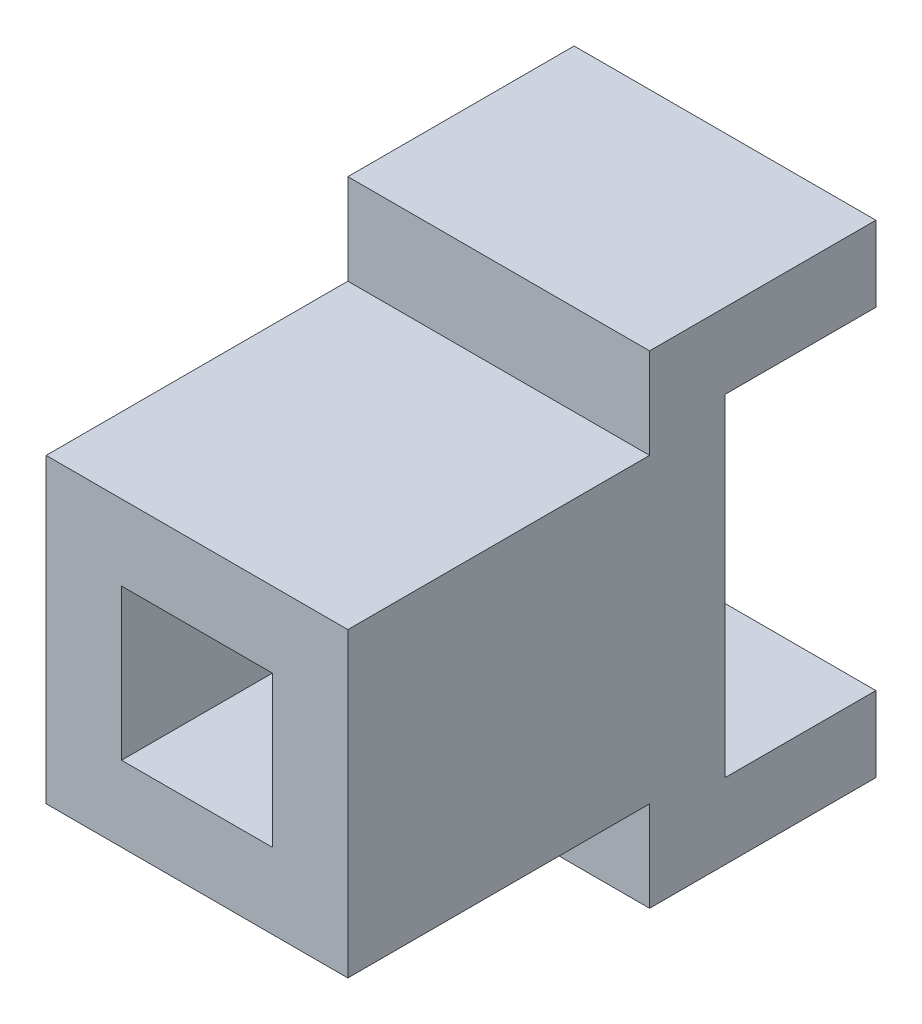
ISO-10303-21;
HEADER;
FILE_DESCRIPTION(('STEP AP214'),'2;1');
FILE_NAME('part.step','',(''),(''),'','','');
FILE_SCHEMA(('AUTOMOTIVE_DESIGN { 1 0 10303 214 1 1 1 1 }'));
ENDSEC;
DATA;
#1=APPLICATION_CONTEXT('core data for automotive mechanical design processes');
#2=APPLICATION_PROTOCOL_DEFINITION('international standard','automotive_design',2000,#1);
#3=PRODUCT_CONTEXT('',#1,'mechanical');
#4=PRODUCT('Part','Part','',(#3));
#5=PRODUCT_RELATED_PRODUCT_CATEGORY('part','',(#4));
#6=PRODUCT_DEFINITION_FORMATION('','',#4);
#7=PRODUCT_DEFINITION_CONTEXT('part definition',#1,'design');
#8=PRODUCT_DEFINITION('design','',#6,#7);
#9=PRODUCT_DEFINITION_SHAPE('','',#8);
#10=(LENGTH_UNIT() NAMED_UNIT(*) SI_UNIT(.MILLI.,.METRE.));
#11=(NAMED_UNIT(*) PLANE_ANGLE_UNIT() SI_UNIT($,.RADIAN.));
#12=(NAMED_UNIT(*) SI_UNIT($,.STERADIAN.) SOLID_ANGLE_UNIT());
#13=UNCERTAINTY_MEASURE_WITH_UNIT(LENGTH_MEASURE(1.E-05),#10,'distance_accuracy_value','');
#14=(GEOMETRIC_REPRESENTATION_CONTEXT(3) GLOBAL_UNCERTAINTY_ASSIGNED_CONTEXT((#13)) GLOBAL_UNIT_ASSIGNED_CONTEXT((#10,
#11,#12)) REPRESENTATION_CONTEXT('',''));
#15=CARTESIAN_POINT('',(0.,0.,0.));
#16=DIRECTION('',(0.,0.,1.));
#17=DIRECTION('',(1.,0.,0.));
#18=AXIS2_PLACEMENT_3D('',#15,#16,#17);
#19=CARTESIAN_POINT('',(0.,0.,-15.));
#20=DIRECTION('',(0.,0.,1.));
#21=DIRECTION('',(1.,0.,0.));
#22=AXIS2_PLACEMENT_3D('',#19,#20,#21);
#23=PLANE('',#22);
#24=DIRECTION('',(0.,-1.,0.));
#25=VECTOR('',#24,1.);
#26=CARTESIAN_POINT('',(20.,-6.00000000000001,-15.));
#27=LINE('',#26,#25);
#28=CARTESIAN_POINT('',(20.,26.,-15.));
#29=VERTEX_POINT('',#28);
#30=CARTESIAN_POINT('',(20.,21.,-15.));
#31=VERTEX_POINT('',#30);
#32=EDGE_CURVE('E177',#29,#31,#27,.T.);
#33=ORIENTED_EDGE('',*,*,#32,.T.);
#34=DIRECTION('',(1.,0.,0.));
#35=VECTOR('',#34,1.);
#36=CARTESIAN_POINT('',(20.,21.,-15.));
#37=LINE('',#36,#35);
#38=CARTESIAN_POINT('',(0.,21.,-15.));
#39=VERTEX_POINT('',#38);
#40=EDGE_CURVE('E165',#39,#31,#37,.T.);
#41=ORIENTED_EDGE('',*,*,#40,.F.);
#42=DIRECTION('',(0.,1.,0.));
#43=VECTOR('',#42,1.);
#44=CARTESIAN_POINT('',(0.,-6.,-15.));
#45=LINE('',#44,#43);
#46=CARTESIAN_POINT('',(0.,26.,-15.));
#47=VERTEX_POINT('',#46);
#48=EDGE_CURVE('E182',#39,#47,#45,.T.);
#49=ORIENTED_EDGE('',*,*,#48,.T.);
#50=DIRECTION('',(1.,0.,0.));
#51=VECTOR('',#50,1.);
#52=CARTESIAN_POINT('',(20.,26.,-15.));
#53=LINE('',#52,#51);
#54=EDGE_CURVE('E186',#47,#29,#53,.T.);
#55=ORIENTED_EDGE('',*,*,#54,.T.);
#56=EDGE_LOOP('',(#33,#41,#49,#55));
#57=FACE_BOUND('',#56,.T.);
#58=ADVANCED_FACE('F36',(#57),#23,.F.);
#59=CARTESIAN_POINT('',(0.,0.,20.));
#60=DIRECTION('',(1.,0.,0.));
#61=DIRECTION('',(0.,0.,-1.));
#62=AXIS2_PLACEMENT_3D('',#59,#60,#61);
#63=PLANE('',#62);
#64=ORIENTED_EDGE('',*,*,#48,.F.);
#65=DIRECTION('',(0.,0.,-1.));
#66=VECTOR('',#65,1.);
#67=CARTESIAN_POINT('',(0.,21.,-5.));
#68=LINE('',#67,#66);
#69=CARTESIAN_POINT('',(0.,21.,-5.));
#70=VERTEX_POINT('',#69);
#71=EDGE_CURVE('E172',#70,#39,#68,.T.);
#72=ORIENTED_EDGE('',*,*,#71,.F.);
#73=DIRECTION('',(0.,1.,0.));
#74=VECTOR('',#73,1.);
#75=CARTESIAN_POINT('',(0.,-1.00000000000001,-5.));
#76=LINE('',#75,#74);
#77=CARTESIAN_POINT('',(0.,-1.00000000000001,-5.));
#78=VERTEX_POINT('',#77);
#79=EDGE_CURVE('E155',#78,#70,#76,.T.);
#80=ORIENTED_EDGE('',*,*,#79,.F.);
#81=DIRECTION('',(0.,0.,-1.));
#82=VECTOR('',#81,1.);
#83=CARTESIAN_POINT('',(0.,-1.00000000000001,-5.));
#84=LINE('',#83,#82);
#85=CARTESIAN_POINT('',(0.,-1.00000000000001,-15.));
#86=VERTEX_POINT('',#85);
#87=EDGE_CURVE('E152',#78,#86,#84,.T.);
#88=ORIENTED_EDGE('',*,*,#87,.T.);
#89=CARTESIAN_POINT('',(0.,-6.,-15.));
#90=VERTEX_POINT('',#89);
#91=EDGE_CURVE('E183',#90,#86,#45,.T.);
#92=ORIENTED_EDGE('',*,*,#91,.F.);
#93=DIRECTION('',(0.,0.,1.));
#94=VECTOR('',#93,1.);
#95=CARTESIAN_POINT('',(0.,-6.,-15.));
#96=LINE('',#95,#94);
#97=CARTESIAN_POINT('',(0.,-6.,0.));
#98=VERTEX_POINT('',#97);
#99=EDGE_CURVE('E206',#90,#98,#96,.T.);
#100=ORIENTED_EDGE('',*,*,#99,.T.);
#101=DIRECTION('',(0.,1.,0.));
#102=VECTOR('',#101,1.);
#103=CARTESIAN_POINT('',(0.,-6.,0.));
#104=LINE('',#103,#102);
#105=CARTESIAN_POINT('',(0.,0.,0.));
#106=VERTEX_POINT('',#105);
#107=EDGE_CURVE('E196',#98,#106,#104,.T.);
#108=ORIENTED_EDGE('',*,*,#107,.T.);
#109=DIRECTION('',(0.,0.,-1.));
#110=VECTOR('',#109,1.);
#111=CARTESIAN_POINT('',(0.,0.,20.));
#112=LINE('',#111,#110);
#113=CARTESIAN_POINT('',(0.,0.,20.));
#114=VERTEX_POINT('',#113);
#115=EDGE_CURVE('E11',#114,#106,#112,.T.);
#116=ORIENTED_EDGE('',*,*,#115,.F.);
#117=DIRECTION('',(0.,-1.,0.));
#118=VECTOR('',#117,1.);
#119=CARTESIAN_POINT('',(0.,0.,20.));
#120=LINE('',#119,#118);
#121=CARTESIAN_POINT('',(0.,20.,20.));
#122=VERTEX_POINT('',#121);
#123=EDGE_CURVE('E246',#122,#114,#120,.T.);
#124=ORIENTED_EDGE('',*,*,#123,.F.);
#125=DIRECTION('',(0.,0.,-1.));
#126=VECTOR('',#125,1.);
#127=CARTESIAN_POINT('',(0.,20.,20.));
#128=LINE('',#127,#126);
#129=CARTESIAN_POINT('',(0.,20.,0.));
#130=VERTEX_POINT('',#129);
#131=EDGE_CURVE('E256',#122,#130,#128,.T.);
#132=ORIENTED_EDGE('',*,*,#131,.T.);
#133=CARTESIAN_POINT('',(0.,26.,0.));
#134=VERTEX_POINT('',#133);
#135=EDGE_CURVE('E195',#130,#134,#104,.T.);
#136=ORIENTED_EDGE('',*,*,#135,.T.);
#137=DIRECTION('',(0.,0.,1.));
#138=VECTOR('',#137,1.);
#139=CARTESIAN_POINT('',(0.,26.,-15.));
#140=LINE('',#139,#138);
#141=EDGE_CURVE('E203',#47,#134,#140,.T.);
#142=ORIENTED_EDGE('',*,*,#141,.F.);
#143=EDGE_LOOP('',(#64,#72,#80,#88,#92,#100,#108,#116,#124,#132,#136,#142));
#144=FACE_BOUND('',#143,.T.);
#145=ADVANCED_FACE('F38',(#144),#63,.F.);
#146=CARTESIAN_POINT('',(0.,0.,20.));
#147=DIRECTION('',(0.,1.,0.));
#148=DIRECTION('',(0.,0.,1.));
#149=AXIS2_PLACEMENT_3D('',#146,#147,#148);
#150=PLANE('',#149);
#151=DIRECTION('',(1.,0.,0.));
#152=VECTOR('',#151,1.);
#153=CARTESIAN_POINT('',(0.,0.,0.));
#154=LINE('',#153,#152);
#155=CARTESIAN_POINT('',(20.,0.,0.));
#156=VERTEX_POINT('',#155);
#157=EDGE_CURVE('E238',#106,#156,#154,.T.);
#158=ORIENTED_EDGE('',*,*,#157,.T.);
#159=DIRECTION('',(0.,0.,-1.));
#160=VECTOR('',#159,1.);
#161=CARTESIAN_POINT('',(20.,0.,20.));
#162=LINE('',#161,#160);
#163=CARTESIAN_POINT('',(20.,0.,20.));
#164=VERTEX_POINT('',#163);
#165=EDGE_CURVE('E44',#164,#156,#162,.T.);
#166=ORIENTED_EDGE('',*,*,#165,.F.);
#167=DIRECTION('',(1.,0.,0.));
#168=VECTOR('',#167,1.);
#169=CARTESIAN_POINT('',(0.,0.,20.));
#170=LINE('',#169,#168);
#171=EDGE_CURVE('E249',#114,#164,#170,.T.);
#172=ORIENTED_EDGE('',*,*,#171,.F.);
#173=ORIENTED_EDGE('',*,*,#115,.T.);
#174=EDGE_LOOP('',(#158,#166,#172,#173));
#175=FACE_BOUND('',#174,.T.);
#176=ADVANCED_FACE('F271',(#175),#150,.F.);
#177=CARTESIAN_POINT('',(20.,0.,20.));
#178=DIRECTION('',(-1.,0.,0.));
#179=DIRECTION('',(0.,0.,1.));
#180=AXIS2_PLACEMENT_3D('',#177,#178,#179);
#181=PLANE('',#180);
#182=DIRECTION('',(0.,-1.,0.));
#183=VECTOR('',#182,1.);
#184=CARTESIAN_POINT('',(20.,-1.,-5.));
#185=LINE('',#184,#183);
#186=CARTESIAN_POINT('',(20.,21.,-5.));
#187=VERTEX_POINT('',#186);
#188=CARTESIAN_POINT('',(20.,-1.,-5.));
#189=VERTEX_POINT('',#188);
#190=EDGE_CURVE('E156',#187,#189,#185,.T.);
#191=ORIENTED_EDGE('',*,*,#190,.F.);
#192=DIRECTION('',(0.,0.,-1.));
#193=VECTOR('',#192,1.);
#194=CARTESIAN_POINT('',(20.,21.,-5.));
#195=LINE('',#194,#193);
#196=EDGE_CURVE('E291',#187,#31,#195,.T.);
#197=ORIENTED_EDGE('',*,*,#196,.T.);
#198=ORIENTED_EDGE('',*,*,#32,.F.);
#199=DIRECTION('',(0.,0.,1.));
#200=VECTOR('',#199,1.);
#201=CARTESIAN_POINT('',(20.,26.,-15.));
#202=LINE('',#201,#200);
#203=CARTESIAN_POINT('',(20.,26.,0.));
#204=VERTEX_POINT('',#203);
#205=EDGE_CURVE('E188',#29,#204,#202,.T.);
#206=ORIENTED_EDGE('',*,*,#205,.T.);
#207=DIRECTION('',(0.,-1.,0.));
#208=VECTOR('',#207,1.);
#209=CARTESIAN_POINT('',(20.,-6.00000000000001,0.));
#210=LINE('',#209,#208);
#211=CARTESIAN_POINT('',(20.,20.,0.));
#212=VERTEX_POINT('',#211);
#213=EDGE_CURVE('E189',#204,#212,#210,.T.);
#214=ORIENTED_EDGE('',*,*,#213,.T.);
#215=DIRECTION('',(0.,0.,-1.));
#216=VECTOR('',#215,1.);
#217=CARTESIAN_POINT('',(20.,20.,20.));
#218=LINE('',#217,#216);
#219=CARTESIAN_POINT('',(20.,20.,20.));
#220=VERTEX_POINT('',#219);
#221=EDGE_CURVE('E263',#220,#212,#218,.T.);
#222=ORIENTED_EDGE('',*,*,#221,.F.);
#223=DIRECTION('',(0.,1.,0.));
#224=VECTOR('',#223,1.);
#225=CARTESIAN_POINT('',(20.,0.,20.));
#226=LINE('',#225,#224);
#227=EDGE_CURVE('E252',#164,#220,#226,.T.);
#228=ORIENTED_EDGE('',*,*,#227,.F.);
#229=ORIENTED_EDGE('',*,*,#165,.T.);
#230=CARTESIAN_POINT('',(20.,-6.00000000000001,0.));
#231=VERTEX_POINT('',#230);
#232=EDGE_CURVE('E193',#156,#231,#210,.T.);
#233=ORIENTED_EDGE('',*,*,#232,.T.);
#234=DIRECTION('',(0.,0.,1.));
#235=VECTOR('',#234,1.);
#236=CARTESIAN_POINT('',(20.,-6.00000000000001,-15.));
#237=LINE('',#236,#235);
#238=CARTESIAN_POINT('',(20.,-6.00000000000001,-15.));
#239=VERTEX_POINT('',#238);
#240=EDGE_CURVE('E209',#239,#231,#237,.T.);
#241=ORIENTED_EDGE('',*,*,#240,.F.);
#242=CARTESIAN_POINT('',(20.,-1.,-15.));
#243=VERTEX_POINT('',#242);
#244=EDGE_CURVE('E170',#243,#239,#27,.T.);
#245=ORIENTED_EDGE('',*,*,#244,.F.);
#246=DIRECTION('',(0.,0.,-1.));
#247=VECTOR('',#246,1.);
#248=CARTESIAN_POINT('',(20.,-1.,-5.));
#249=LINE('',#248,#247);
#250=EDGE_CURVE('E51',#189,#243,#249,.T.);
#251=ORIENTED_EDGE('',*,*,#250,.F.);
#252=EDGE_LOOP('',(#191,#197,#198,#206,#214,#222,#228,#229,#233,#241,#245,#251));
#253=FACE_BOUND('',#252,.T.);
#254=ADVANCED_FACE('F168',(#253),#181,.F.);
#255=CARTESIAN_POINT('',(0.,20.,20.));
#256=DIRECTION('',(0.,-1.,0.));
#257=DIRECTION('',(0.,0.,-1.));
#258=AXIS2_PLACEMENT_3D('',#255,#256,#257);
#259=PLANE('',#258);
#260=DIRECTION('',(-1.,0.,0.));
#261=VECTOR('',#260,1.);
#262=CARTESIAN_POINT('',(0.,20.,0.));
#263=LINE('',#262,#261);
#264=EDGE_CURVE('E250',#212,#130,#263,.T.);
#265=ORIENTED_EDGE('',*,*,#264,.T.);
#266=ORIENTED_EDGE('',*,*,#131,.F.);
#267=DIRECTION('',(-1.,0.,0.));
#268=VECTOR('',#267,1.);
#269=CARTESIAN_POINT('',(0.,20.,20.));
#270=LINE('',#269,#268);
#271=EDGE_CURVE('E254',#220,#122,#270,.T.);
#272=ORIENTED_EDGE('',*,*,#271,.F.);
#273=ORIENTED_EDGE('',*,*,#221,.T.);
#274=EDGE_LOOP('',(#265,#266,#272,#273));
#275=FACE_BOUND('',#274,.T.);
#276=ADVANCED_FACE('F309',(#275),#259,.F.);
#277=CARTESIAN_POINT('',(0.,0.,20.));
#278=DIRECTION('',(0.,0.,-1.));
#279=DIRECTION('',(-1.,0.,0.));
#280=AXIS2_PLACEMENT_3D('',#277,#278,#279);
#281=PLANE('',#280);
#282=DIRECTION('',(-1.,0.,0.));
#283=VECTOR('',#282,1.);
#284=CARTESIAN_POINT('',(5.,5.,20.));
#285=LINE('',#284,#283);
#286=CARTESIAN_POINT('',(15.,5.,20.));
#287=VERTEX_POINT('',#286);
#288=CARTESIAN_POINT('',(5.,5.,20.));
#289=VERTEX_POINT('',#288);
#290=EDGE_CURVE('E221',#287,#289,#285,.T.);
#291=ORIENTED_EDGE('',*,*,#290,.T.);
#292=DIRECTION('',(0.,1.,0.));
#293=VECTOR('',#292,1.);
#294=CARTESIAN_POINT('',(5.,15.,20.));
#295=LINE('',#294,#293);
#296=CARTESIAN_POINT('',(5.,15.,20.));
#297=VERTEX_POINT('',#296);
#298=EDGE_CURVE('E213',#289,#297,#295,.T.);
#299=ORIENTED_EDGE('',*,*,#298,.T.);
#300=DIRECTION('',(1.,0.,0.));
#301=VECTOR('',#300,1.);
#302=CARTESIAN_POINT('',(5.,15.,20.));
#303=LINE('',#302,#301);
#304=CARTESIAN_POINT('',(15.,15.,20.));
#305=VERTEX_POINT('',#304);
#306=EDGE_CURVE('E216',#297,#305,#303,.T.);
#307=ORIENTED_EDGE('',*,*,#306,.T.);
#308=DIRECTION('',(0.,-1.,0.));
#309=VECTOR('',#308,1.);
#310=CARTESIAN_POINT('',(15.,15.,20.));
#311=LINE('',#310,#309);
#312=EDGE_CURVE('E59',#305,#287,#311,.T.);
#313=ORIENTED_EDGE('',*,*,#312,.T.);
#314=EDGE_LOOP('',(#291,#299,#307,#313));
#315=FACE_BOUND('',#314,.T.);
#316=ORIENTED_EDGE('',*,*,#123,.T.);
#317=ORIENTED_EDGE('',*,*,#171,.T.);
#318=ORIENTED_EDGE('',*,*,#227,.T.);
#319=ORIENTED_EDGE('',*,*,#271,.T.);
#320=EDGE_LOOP('',(#316,#317,#318,#319));
#321=FACE_BOUND('',#320,.T.);
#322=ADVANCED_FACE('F312',(#315,#321),#281,.F.);
#323=CARTESIAN_POINT('',(5.,15.,20.));
#324=DIRECTION('',(-1.,0.,0.));
#325=DIRECTION('',(0.,-1.,0.));
#326=AXIS2_PLACEMENT_3D('',#323,#324,#325);
#327=PLANE('',#326);
#328=DIRECTION('',(0.,1.,0.));
#329=VECTOR('',#328,1.);
#330=CARTESIAN_POINT('',(5.,15.,0.));
#331=LINE('',#330,#329);
#332=CARTESIAN_POINT('',(5.,5.,0.));
#333=VERTEX_POINT('',#332);
#334=CARTESIAN_POINT('',(5.,15.,0.));
#335=VERTEX_POINT('',#334);
#336=EDGE_CURVE('E212',#333,#335,#331,.T.);
#337=ORIENTED_EDGE('',*,*,#336,.T.);
#338=DIRECTION('',(0.,0.,-1.));
#339=VECTOR('',#338,1.);
#340=CARTESIAN_POINT('',(5.,15.,20.));
#341=LINE('',#340,#339);
#342=EDGE_CURVE('E224',#297,#335,#341,.T.);
#343=ORIENTED_EDGE('',*,*,#342,.F.);
#344=ORIENTED_EDGE('',*,*,#298,.F.);
#345=DIRECTION('',(0.,0.,-1.));
#346=VECTOR('',#345,1.);
#347=CARTESIAN_POINT('',(5.,5.,20.));
#348=LINE('',#347,#346);
#349=EDGE_CURVE('E235',#289,#333,#348,.T.);
#350=ORIENTED_EDGE('',*,*,#349,.T.);
#351=EDGE_LOOP('',(#337,#343,#344,#350));
#352=FACE_BOUND('',#351,.T.);
#353=ADVANCED_FACE('F314',(#352),#327,.F.);
#354=CARTESIAN_POINT('',(5.,5.,20.));
#355=DIRECTION('',(0.,-1.,0.));
#356=DIRECTION('',(1.,0.,0.));
#357=AXIS2_PLACEMENT_3D('',#354,#355,#356);
#358=PLANE('',#357);
#359=DIRECTION('',(-1.,0.,0.));
#360=VECTOR('',#359,1.);
#361=CARTESIAN_POINT('',(5.,5.,0.));
#362=LINE('',#361,#360);
#363=CARTESIAN_POINT('',(15.,5.,0.));
#364=VERTEX_POINT('',#363);
#365=EDGE_CURVE('E217',#364,#333,#362,.T.);
#366=ORIENTED_EDGE('',*,*,#365,.T.);
#367=ORIENTED_EDGE('',*,*,#349,.F.);
#368=ORIENTED_EDGE('',*,*,#290,.F.);
#369=DIRECTION('',(0.,0.,-1.));
#370=VECTOR('',#369,1.);
#371=CARTESIAN_POINT('',(15.,5.,20.));
#372=LINE('',#371,#370);
#373=EDGE_CURVE('E239',#287,#364,#372,.T.);
#374=ORIENTED_EDGE('',*,*,#373,.T.);
#375=EDGE_LOOP('',(#366,#367,#368,#374));
#376=FACE_BOUND('',#375,.T.);
#377=ADVANCED_FACE('F321',(#376),#358,.F.);
#378=CARTESIAN_POINT('',(15.,15.,20.));
#379=DIRECTION('',(1.,0.,0.));
#380=DIRECTION('',(0.,0.,-1.));
#381=AXIS2_PLACEMENT_3D('',#378,#379,#380);
#382=PLANE('',#381);
#383=DIRECTION('',(0.,-1.,0.));
#384=VECTOR('',#383,1.);
#385=CARTESIAN_POINT('',(15.,15.,0.));
#386=LINE('',#385,#384);
#387=CARTESIAN_POINT('',(15.,15.,0.));
#388=VERTEX_POINT('',#387);
#389=EDGE_CURVE('E230',#388,#364,#386,.T.);
#390=ORIENTED_EDGE('',*,*,#389,.T.);
#391=ORIENTED_EDGE('',*,*,#373,.F.);
#392=ORIENTED_EDGE('',*,*,#312,.F.);
#393=DIRECTION('',(0.,0.,-1.));
#394=VECTOR('',#393,1.);
#395=CARTESIAN_POINT('',(15.,15.,20.));
#396=LINE('',#395,#394);
#397=EDGE_CURVE('E242',#305,#388,#396,.T.);
#398=ORIENTED_EDGE('',*,*,#397,.T.);
#399=EDGE_LOOP('',(#390,#391,#392,#398));
#400=FACE_BOUND('',#399,.T.);
#401=ADVANCED_FACE('F339',(#400),#382,.F.);
#402=CARTESIAN_POINT('',(5.,15.,20.));
#403=DIRECTION('',(0.,1.,0.));
#404=DIRECTION('',(-1.,0.,0.));
#405=AXIS2_PLACEMENT_3D('',#402,#403,#404);
#406=PLANE('',#405);
#407=DIRECTION('',(1.,0.,0.));
#408=VECTOR('',#407,1.);
#409=CARTESIAN_POINT('',(5.,15.,0.));
#410=LINE('',#409,#408);
#411=EDGE_CURVE('E227',#335,#388,#410,.T.);
#412=ORIENTED_EDGE('',*,*,#411,.T.);
#413=ORIENTED_EDGE('',*,*,#397,.F.);
#414=ORIENTED_EDGE('',*,*,#306,.F.);
#415=ORIENTED_EDGE('',*,*,#342,.T.);
#416=EDGE_LOOP('',(#412,#413,#414,#415));
#417=FACE_BOUND('',#416,.T.);
#418=ADVANCED_FACE('F333',(#417),#406,.F.);
#419=ORIENTED_EDGE('',*,*,#91,.T.);
#420=DIRECTION('',(-1.,0.,0.));
#421=VECTOR('',#420,1.);
#422=CARTESIAN_POINT('',(20.,-1.,-15.));
#423=LINE('',#422,#421);
#424=EDGE_CURVE('E286',#243,#86,#423,.T.);
#425=ORIENTED_EDGE('',*,*,#424,.F.);
#426=ORIENTED_EDGE('',*,*,#244,.T.);
#427=DIRECTION('',(-1.,0.,0.));
#428=VECTOR('',#427,1.);
#429=CARTESIAN_POINT('',(20.,-6.00000000000001,-15.));
#430=LINE('',#429,#428);
#431=EDGE_CURVE('E180',#239,#90,#430,.T.);
#432=ORIENTED_EDGE('',*,*,#431,.T.);
#433=EDGE_LOOP('',(#419,#425,#426,#432));
#434=FACE_BOUND('',#433,.T.);
#435=ADVANCED_FACE('F285',(#434),#23,.F.);
#436=CARTESIAN_POINT('',(20.,26.,-15.));
#437=DIRECTION('',(0.,-1.,0.));
#438=DIRECTION('',(1.,0.,0.));
#439=AXIS2_PLACEMENT_3D('',#436,#437,#438);
#440=PLANE('',#439);
#441=DIRECTION('',(1.,0.,0.));
#442=VECTOR('',#441,1.);
#443=CARTESIAN_POINT('',(20.,26.,0.));
#444=LINE('',#443,#442);
#445=EDGE_CURVE('E199',#134,#204,#444,.T.);
#446=ORIENTED_EDGE('',*,*,#445,.T.);
#447=ORIENTED_EDGE('',*,*,#205,.F.);
#448=ORIENTED_EDGE('',*,*,#54,.F.);
#449=ORIENTED_EDGE('',*,*,#141,.T.);
#450=EDGE_LOOP('',(#446,#447,#448,#449));
#451=FACE_BOUND('',#450,.T.);
#452=ADVANCED_FACE('F303',(#451),#440,.F.);
#453=CARTESIAN_POINT('',(20.,-6.00000000000001,-15.));
#454=DIRECTION('',(0.,1.,0.));
#455=DIRECTION('',(-1.,0.,0.));
#456=AXIS2_PLACEMENT_3D('',#453,#454,#455);
#457=PLANE('',#456);
#458=DIRECTION('',(-1.,0.,0.));
#459=VECTOR('',#458,1.);
#460=CARTESIAN_POINT('',(20.,-6.00000000000001,0.));
#461=LINE('',#460,#459);
#462=EDGE_CURVE('E192',#231,#98,#461,.T.);
#463=ORIENTED_EDGE('',*,*,#462,.T.);
#464=ORIENTED_EDGE('',*,*,#99,.F.);
#465=ORIENTED_EDGE('',*,*,#431,.F.);
#466=ORIENTED_EDGE('',*,*,#240,.T.);
#467=EDGE_LOOP('',(#463,#464,#465,#466));
#468=FACE_BOUND('',#467,.T.);
#469=ADVANCED_FACE('F283',(#468),#457,.F.);
#470=CARTESIAN_POINT('',(0.,0.,0.));
#471=DIRECTION('',(0.,0.,1.));
#472=DIRECTION('',(1.,0.,0.));
#473=AXIS2_PLACEMENT_3D('',#470,#471,#472);
#474=PLANE('',#473);
#475=ORIENTED_EDGE('',*,*,#157,.F.);
#476=ORIENTED_EDGE('',*,*,#107,.F.);
#477=ORIENTED_EDGE('',*,*,#462,.F.);
#478=ORIENTED_EDGE('',*,*,#232,.F.);
#479=EDGE_LOOP('',(#475,#476,#477,#478));
#480=FACE_BOUND('',#479,.T.);
#481=ADVANCED_FACE('F275',(#480),#474,.T.);
#482=ORIENTED_EDGE('',*,*,#264,.F.);
#483=ORIENTED_EDGE('',*,*,#213,.F.);
#484=ORIENTED_EDGE('',*,*,#445,.F.);
#485=ORIENTED_EDGE('',*,*,#135,.F.);
#486=EDGE_LOOP('',(#482,#483,#484,#485));
#487=FACE_BOUND('',#486,.T.);
#488=ADVANCED_FACE('F306',(#487),#474,.T.);
#489=ORIENTED_EDGE('',*,*,#336,.F.);
#490=ORIENTED_EDGE('',*,*,#365,.F.);
#491=ORIENTED_EDGE('',*,*,#389,.F.);
#492=ORIENTED_EDGE('',*,*,#411,.F.);
#493=EDGE_LOOP('',(#489,#490,#491,#492));
#494=FACE_BOUND('',#493,.T.);
#495=ADVANCED_FACE('F351',(#494),#474,.T.);
#496=CARTESIAN_POINT('',(20.,21.,-5.));
#497=DIRECTION('',(0.,1.,0.));
#498=DIRECTION('',(0.,0.,1.));
#499=AXIS2_PLACEMENT_3D('',#496,#497,#498);
#500=PLANE('',#499);
#501=ORIENTED_EDGE('',*,*,#40,.T.);
#502=ORIENTED_EDGE('',*,*,#196,.F.);
#503=DIRECTION('',(1.,0.,0.));
#504=VECTOR('',#503,1.);
#505=CARTESIAN_POINT('',(20.,21.,-5.));
#506=LINE('',#505,#504);
#507=EDGE_CURVE('E162',#70,#187,#506,.T.);
#508=ORIENTED_EDGE('',*,*,#507,.F.);
#509=ORIENTED_EDGE('',*,*,#71,.T.);
#510=EDGE_LOOP('',(#501,#502,#508,#509));
#511=FACE_BOUND('',#510,.T.);
#512=ADVANCED_FACE('F295',(#511),#500,.F.);
#513=CARTESIAN_POINT('',(20.,-1.,-5.));
#514=DIRECTION('',(0.,-1.,0.));
#515=DIRECTION('',(1.,0.,0.));
#516=AXIS2_PLACEMENT_3D('',#513,#514,#515);
#517=PLANE('',#516);
#518=ORIENTED_EDGE('',*,*,#424,.T.);
#519=ORIENTED_EDGE('',*,*,#87,.F.);
#520=DIRECTION('',(-1.,0.,0.));
#521=VECTOR('',#520,1.);
#522=CARTESIAN_POINT('',(20.,-1.,-5.));
#523=LINE('',#522,#521);
#524=EDGE_CURVE('E148',#189,#78,#523,.T.);
#525=ORIENTED_EDGE('',*,*,#524,.F.);
#526=ORIENTED_EDGE('',*,*,#250,.T.);
#527=EDGE_LOOP('',(#518,#519,#525,#526));
#528=FACE_BOUND('',#527,.T.);
#529=ADVANCED_FACE('F150',(#528),#517,.F.);
#530=CARTESIAN_POINT('',(0.,0.,-5.));
#531=DIRECTION('',(0.,0.,1.));
#532=DIRECTION('',(1.,0.,0.));
#533=AXIS2_PLACEMENT_3D('',#530,#531,#532);
#534=PLANE('',#533);
#535=ORIENTED_EDGE('',*,*,#190,.T.);
#536=ORIENTED_EDGE('',*,*,#524,.T.);
#537=ORIENTED_EDGE('',*,*,#79,.T.);
#538=ORIENTED_EDGE('',*,*,#507,.T.);
#539=EDGE_LOOP('',(#535,#536,#537,#538));
#540=FACE_BOUND('',#539,.T.);
#541=ADVANCED_FACE('F160',(#540),#534,.F.);
#542=CLOSED_SHELL('',(#58,#145,#176,#254,#276,#322,#353,#377,#401,#418,#435,#452,#469,#481,#488,
#495,#512,#529,#541));
#543=MANIFOLD_SOLID_BREP('B2',#542);
#544=ADVANCED_BREP_SHAPE_REPRESENTATION('',(#18,#543),#14);
#545=SHAPE_DEFINITION_REPRESENTATION(#9,#544);
ENDSEC;
END-ISO-10303-21;
